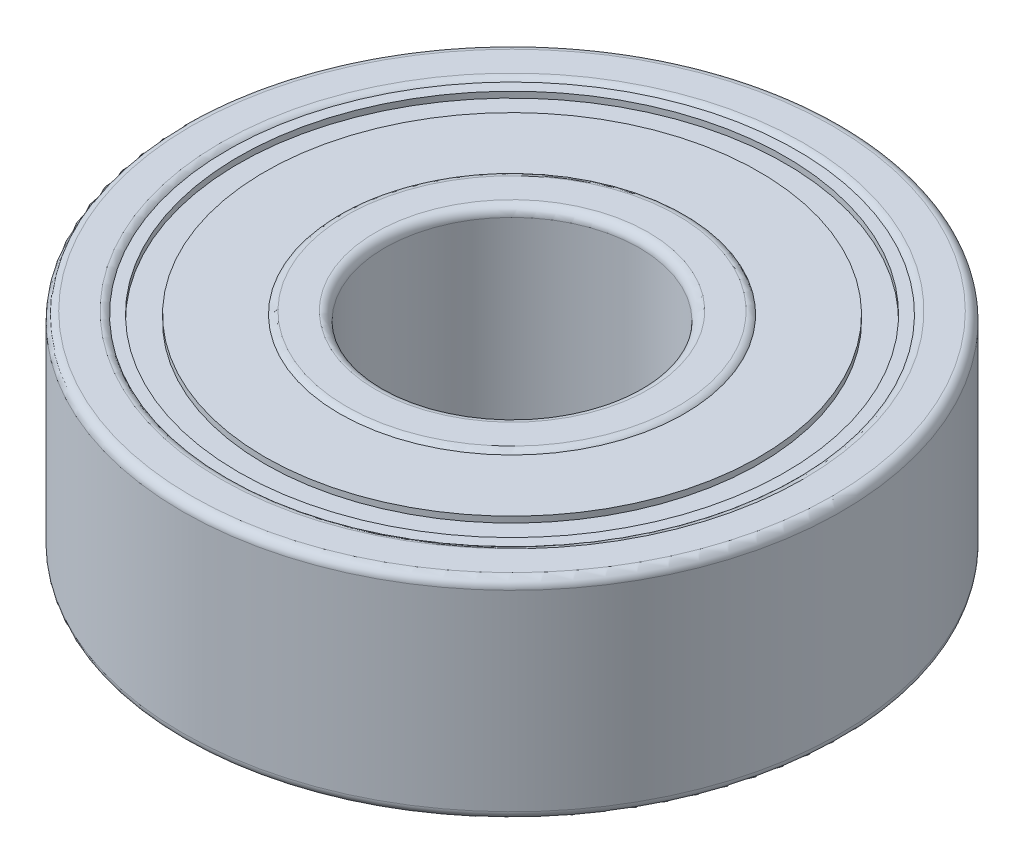
ISO-10303-21;
HEADER;
FILE_DESCRIPTION(('STEP AP214'),'2;1');
FILE_NAME('part.step','',(''),(''),'','','');
FILE_SCHEMA(('AUTOMOTIVE_DESIGN { 1 0 10303 214 1 1 1 1 }'));
ENDSEC;
DATA;
#1=APPLICATION_CONTEXT('core data for automotive mechanical design processes');
#2=APPLICATION_PROTOCOL_DEFINITION('international standard','automotive_design',2000,#1);
#3=PRODUCT_CONTEXT('',#1,'mechanical');
#4=PRODUCT('Part','Part','',(#3));
#5=PRODUCT_RELATED_PRODUCT_CATEGORY('part','',(#4));
#6=PRODUCT_DEFINITION_FORMATION('','',#4);
#7=PRODUCT_DEFINITION_CONTEXT('part definition',#1,'design');
#8=PRODUCT_DEFINITION('design','',#6,#7);
#9=PRODUCT_DEFINITION_SHAPE('','',#8);
#10=(LENGTH_UNIT() NAMED_UNIT(*) SI_UNIT(.MILLI.,.METRE.));
#11=(NAMED_UNIT(*) PLANE_ANGLE_UNIT() SI_UNIT($,.RADIAN.));
#12=(NAMED_UNIT(*) SI_UNIT($,.STERADIAN.) SOLID_ANGLE_UNIT());
#13=UNCERTAINTY_MEASURE_WITH_UNIT(LENGTH_MEASURE(1.E-05),#10,'distance_accuracy_value','');
#14=(GEOMETRIC_REPRESENTATION_CONTEXT(3) GLOBAL_UNCERTAINTY_ASSIGNED_CONTEXT((#13)) GLOBAL_UNIT_ASSIGNED_CONTEXT((#10,
#11,#12)) REPRESENTATION_CONTEXT('',''));
#15=CARTESIAN_POINT('',(0.,0.,0.));
#16=DIRECTION('',(0.,0.,1.));
#17=DIRECTION('',(1.,0.,0.));
#18=AXIS2_PLACEMENT_3D('',#15,#16,#17);
#19=CARTESIAN_POINT('',(0.,6.9,0.));
#20=DIRECTION('',(0.,1.,0.));
#21=DIRECTION('',(0.,0.,1.));
#22=AXIS2_PLACEMENT_3D('',#19,#20,#21);
#23=PLANE('',#22);
#24=CARTESIAN_POINT('',(0.,6.9,0.));
#25=DIRECTION('',(0.,1.,0.));
#26=DIRECTION('',(0.,0.,1.));
#27=AXIS2_PLACEMENT_3D('',#24,#25,#26);
#28=CIRCLE('',#27,5.75);
#29=CARTESIAN_POINT('',(0.,6.9,5.75));
#30=VERTEX_POINT('',#29);
#31=EDGE_CURVE('E103',#30,#30,#28,.T.);
#32=ORIENTED_EDGE('',*,*,#31,.F.);
#33=EDGE_LOOP('',(#32));
#34=FACE_BOUND('',#33,.T.);
#35=CARTESIAN_POINT('',(0.,6.9,0.));
#36=DIRECTION('',(0.,1.,0.));
#37=DIRECTION('',(0.,0.,1.));
#38=AXIS2_PLACEMENT_3D('',#35,#36,#37);
#39=CIRCLE('',#38,8.25);
#40=CARTESIAN_POINT('',(0.,6.9,8.25));
#41=VERTEX_POINT('',#40);
#42=EDGE_CURVE('E116',#41,#41,#39,.T.);
#43=ORIENTED_EDGE('',*,*,#42,.T.);
#44=EDGE_LOOP('',(#43));
#45=FACE_BOUND('',#44,.T.);
#46=ADVANCED_FACE('F39',(#34,#45),#23,.T.);
#47=CARTESIAN_POINT('',(0.,7.,0.));
#48=DIRECTION('',(0.,1.,0.));
#49=DIRECTION('',(0.,0.,1.));
#50=AXIS2_PLACEMENT_3D('',#47,#48,#49);
#51=PLANE('',#50);
#52=CARTESIAN_POINT('',(0.,7.,0.));
#53=DIRECTION('',(0.,1.,0.));
#54=DIRECTION('',(0.,0.,1.));
#55=AXIS2_PLACEMENT_3D('',#52,#53,#54);
#56=CIRCLE('',#55,5.52639320225002);
#57=CARTESIAN_POINT('',(0.,7.,5.52639320225002));
#58=VERTEX_POINT('',#57);
#59=EDGE_CURVE('E10',#58,#58,#56,.T.);
#60=ORIENTED_EDGE('',*,*,#59,.T.);
#61=EDGE_LOOP('',(#60));
#62=FACE_BOUND('',#61,.T.);
#63=CARTESIAN_POINT('',(0.,7.,0.));
#64=DIRECTION('',(0.,1.,0.));
#65=DIRECTION('',(0.,0.,1.));
#66=AXIS2_PLACEMENT_3D('',#63,#64,#65);
#67=CIRCLE('',#66,4.55);
#68=CARTESIAN_POINT('',(0.,7.,4.55));
#69=VERTEX_POINT('',#68);
#70=EDGE_CURVE('E47',#69,#69,#67,.F.);
#71=ORIENTED_EDGE('',*,*,#70,.T.);
#72=EDGE_LOOP('',(#71));
#73=FACE_BOUND('',#72,.T.);
#74=ADVANCED_FACE('F149',(#62,#73),#51,.T.);
#75=CARTESIAN_POINT('',(0.,0.,0.));
#76=DIRECTION('',(0.,1.,0.));
#77=DIRECTION('',(0.,0.,1.));
#78=AXIS2_PLACEMENT_3D('',#75,#76,#77);
#79=PLANE('',#78);
#80=CARTESIAN_POINT('',(0.,0.,0.));
#81=DIRECTION('',(0.,1.,0.));
#82=DIRECTION('',(0.,0.,1.));
#83=AXIS2_PLACEMENT_3D('',#80,#81,#82);
#84=CIRCLE('',#83,4.55);
#85=CARTESIAN_POINT('',(0.,0.,4.55));
#86=VERTEX_POINT('',#85);
#87=EDGE_CURVE('E87',#86,#86,#84,.T.);
#88=ORIENTED_EDGE('',*,*,#87,.T.);
#89=EDGE_LOOP('',(#88));
#90=FACE_BOUND('',#89,.T.);
#91=CARTESIAN_POINT('',(0.,0.,0.));
#92=DIRECTION('',(0.,1.,0.));
#93=DIRECTION('',(0.,0.,1.));
#94=AXIS2_PLACEMENT_3D('',#91,#92,#93);
#95=CIRCLE('',#94,5.52639320225002);
#96=CARTESIAN_POINT('',(0.,0.,5.52639320225002));
#97=VERTEX_POINT('',#96);
#98=EDGE_CURVE('E91',#97,#97,#95,.F.);
#99=ORIENTED_EDGE('',*,*,#98,.T.);
#100=EDGE_LOOP('',(#99));
#101=FACE_BOUND('',#100,.T.);
#102=ADVANCED_FACE('F143',(#90,#101),#79,.F.);
#103=CARTESIAN_POINT('',(0.,7.,0.));
#104=DIRECTION('',(0.,-1.,0.));
#105=DIRECTION('',(0.,0.,-1.));
#106=AXIS2_PLACEMENT_3D('',#103,#104,#105);
#107=CYLINDRICAL_SURFACE('',#106,4.25);
#108=CARTESIAN_POINT('',(0.,0.3,0.));
#109=DIRECTION('',(0.,1.,0.));
#110=DIRECTION('',(0.,0.,1.));
#111=AXIS2_PLACEMENT_3D('',#108,#109,#110);
#112=CIRCLE('',#111,4.25);
#113=CARTESIAN_POINT('',(0.,0.3,4.25));
#114=VERTEX_POINT('',#113);
#115=EDGE_CURVE('E79',#114,#114,#112,.F.);
#116=ORIENTED_EDGE('',*,*,#115,.T.);
#117=EDGE_LOOP('',(#116));
#118=FACE_BOUND('',#117,.T.);
#119=CARTESIAN_POINT('',(0.,6.7,0.));
#120=DIRECTION('',(0.,1.,0.));
#121=DIRECTION('',(0.,0.,1.));
#122=AXIS2_PLACEMENT_3D('',#119,#120,#121);
#123=CIRCLE('',#122,4.25);
#124=CARTESIAN_POINT('',(0.,6.7,4.25));
#125=VERTEX_POINT('',#124);
#126=EDGE_CURVE('E83',#125,#125,#123,.T.);
#127=ORIENTED_EDGE('',*,*,#126,.T.);
#128=EDGE_LOOP('',(#127));
#129=FACE_BOUND('',#128,.T.);
#130=ADVANCED_FACE('F133',(#118,#129),#107,.F.);
#131=CARTESIAN_POINT('',(0.,6.9,0.));
#132=DIRECTION('',(0.,1.,0.));
#133=DIRECTION('',(0.,0.,1.));
#134=AXIS2_PLACEMENT_3D('',#131,#132,#133);
#135=CIRCLE('',#134,9.125);
#136=CARTESIAN_POINT('',(0.,6.9,9.125));
#137=VERTEX_POINT('',#136);
#138=EDGE_CURVE('E108',#137,#137,#135,.T.);
#139=ORIENTED_EDGE('',*,*,#138,.F.);
#140=EDGE_LOOP('',(#139));
#141=FACE_BOUND('',#140,.T.);
#142=CARTESIAN_POINT('',(0.,6.9,0.));
#143=DIRECTION('',(0.,1.,0.));
#144=DIRECTION('',(0.,0.,1.));
#145=AXIS2_PLACEMENT_3D('',#142,#143,#144);
#146=CIRCLE('',#145,9.5);
#147=CARTESIAN_POINT('',(0.,6.9,9.5));
#148=VERTEX_POINT('',#147);
#149=EDGE_CURVE('E120',#148,#148,#146,.F.);
#150=ORIENTED_EDGE('',*,*,#149,.F.);
#151=EDGE_LOOP('',(#150));
#152=FACE_BOUND('',#151,.T.);
#153=ADVANCED_FACE('F130',(#141,#152),#23,.T.);
#154=CARTESIAN_POINT('',(0.,0.1,0.));
#155=DIRECTION('',(0.,1.,0.));
#156=DIRECTION('',(0.,0.,1.));
#157=AXIS2_PLACEMENT_3D('',#154,#155,#156);
#158=PLANE('',#157);
#159=CARTESIAN_POINT('',(0.,0.1,0.));
#160=DIRECTION('',(0.,1.,0.));
#161=DIRECTION('',(0.,0.,1.));
#162=AXIS2_PLACEMENT_3D('',#159,#160,#161);
#163=CIRCLE('',#162,9.5);
#164=CARTESIAN_POINT('',(0.,0.1,9.5));
#165=VERTEX_POINT('',#164);
#166=EDGE_CURVE('E99',#165,#165,#163,.T.);
#167=ORIENTED_EDGE('',*,*,#166,.F.);
#168=EDGE_LOOP('',(#167));
#169=FACE_BOUND('',#168,.T.);
#170=CARTESIAN_POINT('',(0.,0.1,0.));
#171=DIRECTION('',(0.,1.,0.));
#172=DIRECTION('',(0.,0.,1.));
#173=AXIS2_PLACEMENT_3D('',#170,#171,#172);
#174=CIRCLE('',#173,5.75);
#175=CARTESIAN_POINT('',(0.,0.1,5.75));
#176=VERTEX_POINT('',#175);
#177=EDGE_CURVE('E95',#176,#176,#174,.T.);
#178=ORIENTED_EDGE('',*,*,#177,.T.);
#179=EDGE_LOOP('',(#178));
#180=FACE_BOUND('',#179,.T.);
#181=ADVANCED_FACE('F132',(#169,#180),#158,.F.);
#182=CARTESIAN_POINT('',(0.,6.7,0.));
#183=DIRECTION('',(0.,1.,0.));
#184=DIRECTION('',(0.,0.,1.));
#185=AXIS2_PLACEMENT_3D('',#182,#183,#184);
#186=CYLINDRICAL_SURFACE('',#185,9.125);
#187=CARTESIAN_POINT('',(0.,6.7,0.));
#188=DIRECTION('',(0.,1.,0.));
#189=DIRECTION('',(0.,0.,1.));
#190=AXIS2_PLACEMENT_3D('',#187,#188,#189);
#191=CIRCLE('',#190,9.125);
#192=CARTESIAN_POINT('',(0.,6.7,9.125));
#193=VERTEX_POINT('',#192);
#194=EDGE_CURVE('E107',#193,#193,#191,.T.);
#195=ORIENTED_EDGE('',*,*,#194,.F.);
#196=EDGE_LOOP('',(#195));
#197=FACE_BOUND('',#196,.T.);
#198=ORIENTED_EDGE('',*,*,#138,.T.);
#199=EDGE_LOOP('',(#198));
#200=FACE_BOUND('',#199,.T.);
#201=ADVANCED_FACE('F140',(#197,#200),#186,.F.);
#202=CARTESIAN_POINT('',(0.,6.7,0.));
#203=DIRECTION('',(0.,1.,0.));
#204=DIRECTION('',(0.,0.,1.));
#205=AXIS2_PLACEMENT_3D('',#202,#203,#204);
#206=PLANE('',#205);
#207=CARTESIAN_POINT('',(0.,6.7,0.));
#208=DIRECTION('',(0.,1.,0.));
#209=DIRECTION('',(0.,0.,1.));
#210=AXIS2_PLACEMENT_3D('',#207,#208,#209);
#211=CIRCLE('',#210,8.25);
#212=CARTESIAN_POINT('',(0.,6.7,8.25));
#213=VERTEX_POINT('',#212);
#214=EDGE_CURVE('E112',#213,#213,#211,.T.);
#215=ORIENTED_EDGE('',*,*,#214,.F.);
#216=EDGE_LOOP('',(#215));
#217=FACE_BOUND('',#216,.T.);
#218=ORIENTED_EDGE('',*,*,#194,.T.);
#219=EDGE_LOOP('',(#218));
#220=FACE_BOUND('',#219,.T.);
#221=ADVANCED_FACE('F162',(#217,#220),#206,.T.);
#222=CARTESIAN_POINT('',(0.,6.7,0.));
#223=DIRECTION('',(0.,1.,0.));
#224=DIRECTION('',(0.,0.,1.));
#225=AXIS2_PLACEMENT_3D('',#222,#223,#224);
#226=CYLINDRICAL_SURFACE('',#225,8.25);
#227=ORIENTED_EDGE('',*,*,#214,.T.);
#228=EDGE_LOOP('',(#227));
#229=FACE_BOUND('',#228,.T.);
#230=ORIENTED_EDGE('',*,*,#42,.F.);
#231=EDGE_LOOP('',(#230));
#232=FACE_BOUND('',#231,.T.);
#233=ADVANCED_FACE('F159',(#229,#232),#226,.T.);
#234=CARTESIAN_POINT('',(0.,7.,0.));
#235=DIRECTION('',(0.,1.,0.));
#236=DIRECTION('',(0.,0.,1.));
#237=AXIS2_PLACEMENT_3D('',#234,#235,#236);
#238=PLANE('',#237);
#239=CARTESIAN_POINT('',(0.,7.,0.));
#240=DIRECTION('',(0.,1.,0.));
#241=DIRECTION('',(0.,0.,1.));
#242=AXIS2_PLACEMENT_3D('',#239,#240,#241);
#243=CIRCLE('',#242,10.7);
#244=CARTESIAN_POINT('',(0.,7.,10.7));
#245=VERTEX_POINT('',#244);
#246=EDGE_CURVE('E52',#245,#245,#243,.T.);
#247=ORIENTED_EDGE('',*,*,#246,.T.);
#248=EDGE_LOOP('',(#247));
#249=FACE_BOUND('',#248,.T.);
#250=CARTESIAN_POINT('',(0.,7.,0.));
#251=DIRECTION('',(0.,1.,0.));
#252=DIRECTION('',(0.,0.,1.));
#253=AXIS2_PLACEMENT_3D('',#250,#251,#252);
#254=CIRCLE('',#253,9.72360679774998);
#255=CARTESIAN_POINT('',(0.,7.,9.72360679774998));
#256=VERTEX_POINT('',#255);
#257=EDGE_CURVE('E57',#256,#256,#254,.F.);
#258=ORIENTED_EDGE('',*,*,#257,.T.);
#259=EDGE_LOOP('',(#258));
#260=FACE_BOUND('',#259,.T.);
#261=ADVANCED_FACE('F161',(#249,#260),#238,.T.);
#262=CARTESIAN_POINT('',(0.,0.,0.));
#263=DIRECTION('',(0.,1.,0.));
#264=DIRECTION('',(0.,0.,1.));
#265=AXIS2_PLACEMENT_3D('',#262,#263,#264);
#266=PLANE('',#265);
#267=CARTESIAN_POINT('',(0.,0.,0.));
#268=DIRECTION('',(0.,1.,0.));
#269=DIRECTION('',(0.,0.,1.));
#270=AXIS2_PLACEMENT_3D('',#267,#268,#269);
#271=CIRCLE('',#270,9.72360679774998);
#272=CARTESIAN_POINT('',(0.,0.,9.72360679774998));
#273=VERTEX_POINT('',#272);
#274=EDGE_CURVE('E71',#273,#273,#271,.T.);
#275=ORIENTED_EDGE('',*,*,#274,.T.);
#276=EDGE_LOOP('',(#275));
#277=FACE_BOUND('',#276,.T.);
#278=CARTESIAN_POINT('',(0.,0.,0.));
#279=DIRECTION('',(0.,1.,0.));
#280=DIRECTION('',(0.,0.,1.));
#281=AXIS2_PLACEMENT_3D('',#278,#279,#280);
#282=CIRCLE('',#281,10.7);
#283=CARTESIAN_POINT('',(0.,0.,10.7));
#284=VERTEX_POINT('',#283);
#285=EDGE_CURVE('E75',#284,#284,#282,.F.);
#286=ORIENTED_EDGE('',*,*,#285,.T.);
#287=EDGE_LOOP('',(#286));
#288=FACE_BOUND('',#287,.T.);
#289=ADVANCED_FACE('F169',(#277,#288),#266,.F.);
#290=CARTESIAN_POINT('',(0.,7.,0.));
#291=DIRECTION('',(0.,-1.,0.));
#292=DIRECTION('',(0.,0.,-1.));
#293=AXIS2_PLACEMENT_3D('',#290,#291,#292);
#294=CYLINDRICAL_SURFACE('',#293,11.);
#295=CARTESIAN_POINT('',(0.,0.3,0.));
#296=DIRECTION('',(0.,1.,0.));
#297=DIRECTION('',(0.,0.,1.));
#298=AXIS2_PLACEMENT_3D('',#295,#296,#297);
#299=CIRCLE('',#298,11.);
#300=CARTESIAN_POINT('',(0.,0.3,11.));
#301=VERTEX_POINT('',#300);
#302=EDGE_CURVE('E63',#301,#301,#299,.T.);
#303=ORIENTED_EDGE('',*,*,#302,.T.);
#304=EDGE_LOOP('',(#303));
#305=FACE_BOUND('',#304,.T.);
#306=CARTESIAN_POINT('',(0.,6.7,0.));
#307=DIRECTION('',(0.,1.,0.));
#308=DIRECTION('',(0.,0.,1.));
#309=AXIS2_PLACEMENT_3D('',#306,#307,#308);
#310=CIRCLE('',#309,11.);
#311=CARTESIAN_POINT('',(0.,6.7,11.));
#312=VERTEX_POINT('',#311);
#313=EDGE_CURVE('E67',#312,#312,#310,.F.);
#314=ORIENTED_EDGE('',*,*,#313,.T.);
#315=EDGE_LOOP('',(#314));
#316=FACE_BOUND('',#315,.T.);
#317=ADVANCED_FACE('F175',(#305,#316),#294,.T.);
#318=CARTESIAN_POINT('',(0.,0.3,0.));
#319=DIRECTION('',(0.,1.,0.));
#320=DIRECTION('',(0.,0.,1.));
#321=AXIS2_PLACEMENT_3D('',#318,#319,#320);
#322=TOROIDAL_SURFACE('',#321,4.55,0.3);
#323=ORIENTED_EDGE('',*,*,#115,.F.);
#324=EDGE_LOOP('',(#323));
#325=FACE_BOUND('',#324,.T.);
#326=ORIENTED_EDGE('',*,*,#87,.F.);
#327=EDGE_LOOP('',(#326));
#328=FACE_BOUND('',#327,.T.);
#329=ADVANCED_FACE('F239',(#325,#328),#322,.T.);
#330=CARTESIAN_POINT('',(0.,0.3,0.));
#331=DIRECTION('',(0.,-1.,0.));
#332=DIRECTION('',(0.,0.,-1.));
#333=AXIS2_PLACEMENT_3D('',#330,#331,#332);
#334=TOROIDAL_SURFACE('',#333,5.52639320225002,0.3);
#335=ORIENTED_EDGE('',*,*,#98,.F.);
#336=EDGE_LOOP('',(#335));
#337=FACE_BOUND('',#336,.T.);
#338=ORIENTED_EDGE('',*,*,#177,.F.);
#339=EDGE_LOOP('',(#338));
#340=FACE_BOUND('',#339,.T.);
#341=ADVANCED_FACE('F248',(#337,#340),#334,.T.);
#342=CARTESIAN_POINT('',(0.,0.3,0.));
#343=DIRECTION('',(0.,1.,0.));
#344=DIRECTION('',(0.,0.,1.));
#345=AXIS2_PLACEMENT_3D('',#342,#343,#344);
#346=TOROIDAL_SURFACE('',#345,9.72360679774998,0.3);
#347=ORIENTED_EDGE('',*,*,#166,.T.);
#348=EDGE_LOOP('',(#347));
#349=FACE_BOUND('',#348,.T.);
#350=ORIENTED_EDGE('',*,*,#274,.F.);
#351=EDGE_LOOP('',(#350));
#352=FACE_BOUND('',#351,.T.);
#353=ADVANCED_FACE('F258',(#349,#352),#346,.T.);
#354=CARTESIAN_POINT('',(0.,0.3,0.));
#355=DIRECTION('',(0.,1.,0.));
#356=DIRECTION('',(0.,0.,1.));
#357=AXIS2_PLACEMENT_3D('',#354,#355,#356);
#358=TOROIDAL_SURFACE('',#357,10.7,0.3);
#359=ORIENTED_EDGE('',*,*,#285,.F.);
#360=EDGE_LOOP('',(#359));
#361=FACE_BOUND('',#360,.T.);
#362=ORIENTED_EDGE('',*,*,#302,.F.);
#363=EDGE_LOOP('',(#362));
#364=FACE_BOUND('',#363,.T.);
#365=ADVANCED_FACE('F268',(#361,#364),#358,.T.);
#366=CARTESIAN_POINT('',(0.,6.7,0.));
#367=DIRECTION('',(0.,1.,0.));
#368=DIRECTION('',(0.,0.,1.));
#369=AXIS2_PLACEMENT_3D('',#366,#367,#368);
#370=TOROIDAL_SURFACE('',#369,10.7,0.3);
#371=ORIENTED_EDGE('',*,*,#313,.F.);
#372=EDGE_LOOP('',(#371));
#373=FACE_BOUND('',#372,.T.);
#374=ORIENTED_EDGE('',*,*,#246,.F.);
#375=EDGE_LOOP('',(#374));
#376=FACE_BOUND('',#375,.T.);
#377=ADVANCED_FACE('F278',(#373,#376),#370,.T.);
#378=CARTESIAN_POINT('',(0.,6.7,0.));
#379=DIRECTION('',(0.,1.,0.));
#380=DIRECTION('',(0.,0.,1.));
#381=AXIS2_PLACEMENT_3D('',#378,#379,#380);
#382=TOROIDAL_SURFACE('',#381,9.72360679774998,0.3);
#383=ORIENTED_EDGE('',*,*,#257,.F.);
#384=EDGE_LOOP('',(#383));
#385=FACE_BOUND('',#384,.T.);
#386=ORIENTED_EDGE('',*,*,#149,.T.);
#387=EDGE_LOOP('',(#386));
#388=FACE_BOUND('',#387,.T.);
#389=ADVANCED_FACE('F128',(#385,#388),#382,.T.);
#390=CARTESIAN_POINT('',(0.,6.7,0.));
#391=DIRECTION('',(0.,-1.,0.));
#392=DIRECTION('',(0.,0.,-1.));
#393=AXIS2_PLACEMENT_3D('',#390,#391,#392);
#394=TOROIDAL_SURFACE('',#393,5.52639320225002,0.3);
#395=ORIENTED_EDGE('',*,*,#31,.T.);
#396=EDGE_LOOP('',(#395));
#397=FACE_BOUND('',#396,.T.);
#398=ORIENTED_EDGE('',*,*,#59,.F.);
#399=EDGE_LOOP('',(#398));
#400=FACE_BOUND('',#399,.T.);
#401=ADVANCED_FACE('F297',(#397,#400),#394,.T.);
#402=CARTESIAN_POINT('',(0.,6.7,0.));
#403=DIRECTION('',(0.,1.,0.));
#404=DIRECTION('',(0.,0.,1.));
#405=AXIS2_PLACEMENT_3D('',#402,#403,#404);
#406=TOROIDAL_SURFACE('',#405,4.55,0.3);
#407=ORIENTED_EDGE('',*,*,#70,.F.);
#408=EDGE_LOOP('',(#407));
#409=FACE_BOUND('',#408,.T.);
#410=ORIENTED_EDGE('',*,*,#126,.F.);
#411=EDGE_LOOP('',(#410));
#412=FACE_BOUND('',#411,.T.);
#413=ADVANCED_FACE('F41',(#409,#412),#406,.T.);
#414=CLOSED_SHELL('',(#46,#74,#102,#130,#153,#181,#201,#221,#233,#261,#289,#317,#329,#341,#353,
#365,#377,#389,#401,#413));
#415=MANIFOLD_SOLID_BREP('B2',#414);
#416=ADVANCED_BREP_SHAPE_REPRESENTATION('',(#18,#415),#14);
#417=SHAPE_DEFINITION_REPRESENTATION(#9,#416);
ENDSEC;
END-ISO-10303-21;
